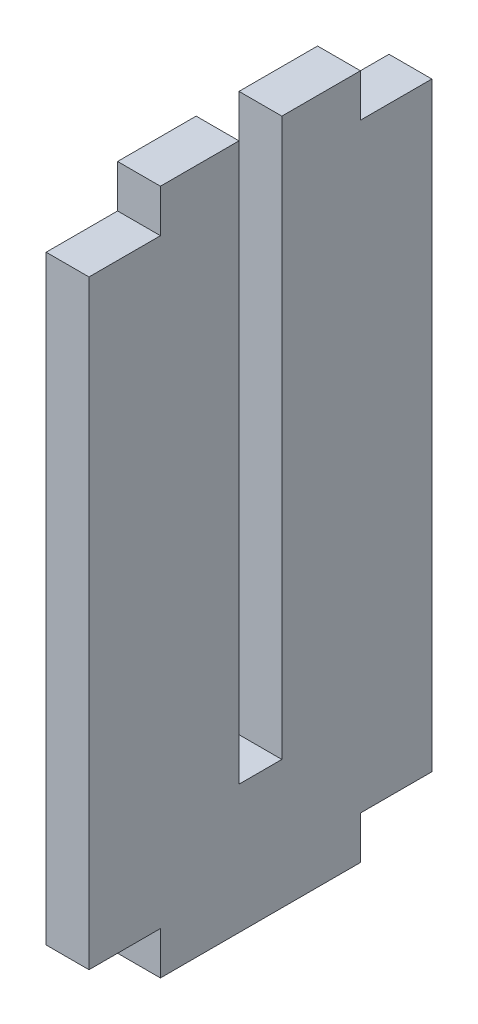
ISO-10303-21;
HEADER;
FILE_DESCRIPTION(('STEP AP214'),'2;1');
FILE_NAME('part.step','',(''),(''),'','','');
FILE_SCHEMA(('AUTOMOTIVE_DESIGN { 1 0 10303 214 1 1 1 1 }'));
ENDSEC;
DATA;
#1=APPLICATION_CONTEXT('core data for automotive mechanical design processes');
#2=APPLICATION_PROTOCOL_DEFINITION('international standard','automotive_design',2000,#1);
#3=PRODUCT_CONTEXT('',#1,'mechanical');
#4=PRODUCT('Part','Part','',(#3));
#5=PRODUCT_RELATED_PRODUCT_CATEGORY('part','',(#4));
#6=PRODUCT_DEFINITION_FORMATION('','',#4);
#7=PRODUCT_DEFINITION_CONTEXT('part definition',#1,'design');
#8=PRODUCT_DEFINITION('design','',#6,#7);
#9=PRODUCT_DEFINITION_SHAPE('','',#8);
#10=(LENGTH_UNIT() NAMED_UNIT(*) SI_UNIT(.MILLI.,.METRE.));
#11=(NAMED_UNIT(*) PLANE_ANGLE_UNIT() SI_UNIT($,.RADIAN.));
#12=(NAMED_UNIT(*) SI_UNIT($,.STERADIAN.) SOLID_ANGLE_UNIT());
#13=UNCERTAINTY_MEASURE_WITH_UNIT(LENGTH_MEASURE(1.E-05),#10,'distance_accuracy_value','');
#14=(GEOMETRIC_REPRESENTATION_CONTEXT(3) GLOBAL_UNCERTAINTY_ASSIGNED_CONTEXT((#13)) GLOBAL_UNIT_ASSIGNED_CONTEXT((#10,
#11,#12)) REPRESENTATION_CONTEXT('',''));
#15=CARTESIAN_POINT('',(0.,0.,0.));
#16=DIRECTION('',(0.,0.,1.));
#17=DIRECTION('',(1.,0.,0.));
#18=AXIS2_PLACEMENT_3D('',#15,#16,#17);
#19=CARTESIAN_POINT('',(6.35,101.6,0.));
#20=DIRECTION('',(0.,-1.,0.));
#21=DIRECTION('',(0.,0.,-1.));
#22=AXIS2_PLACEMENT_3D('',#19,#20,#21);
#23=PLANE('',#22);
#24=DIRECTION('',(0.,0.,1.));
#25=VECTOR('',#24,1.);
#26=CARTESIAN_POINT('',(0.,101.6,0.));
#27=LINE('',#26,#25);
#28=CARTESIAN_POINT('',(0.,101.6,-22.225));
#29=VERTEX_POINT('',#28);
#30=CARTESIAN_POINT('',(0.,101.6,-10.5833333333333));
#31=VERTEX_POINT('',#30);
#32=EDGE_CURVE('E37',#29,#31,#27,.T.);
#33=ORIENTED_EDGE('',*,*,#32,.T.);
#34=DIRECTION('',(1.,0.,0.));
#35=VECTOR('',#34,1.);
#36=CARTESIAN_POINT('',(0.,101.6,-10.5833333333333));
#37=LINE('',#36,#35);
#38=CARTESIAN_POINT('',(6.35,101.6,-10.5833333333333));
#39=VERTEX_POINT('',#38);
#40=EDGE_CURVE('E217',#31,#39,#37,.T.);
#41=ORIENTED_EDGE('',*,*,#40,.T.);
#42=DIRECTION('',(0.,0.,1.));
#43=VECTOR('',#42,1.);
#44=CARTESIAN_POINT('',(6.35,101.6,0.));
#45=LINE('',#44,#43);
#46=CARTESIAN_POINT('',(6.35,101.6,-22.225));
#47=VERTEX_POINT('',#46);
#48=EDGE_CURVE('E42',#47,#39,#45,.T.);
#49=ORIENTED_EDGE('',*,*,#48,.F.);
#50=DIRECTION('',(1.,0.,0.));
#51=VECTOR('',#50,1.);
#52=CARTESIAN_POINT('',(0.,101.6,-22.225));
#53=LINE('',#52,#51);
#54=EDGE_CURVE('E193',#29,#47,#53,.T.);
#55=ORIENTED_EDGE('',*,*,#54,.F.);
#56=EDGE_LOOP('',(#33,#41,#49,#55));
#57=FACE_BOUND('',#56,.T.);
#58=ADVANCED_FACE('F33',(#57),#23,.F.);
#59=CARTESIAN_POINT('',(6.35,0.,0.));
#60=DIRECTION('',(0.,0.,-1.));
#61=DIRECTION('',(-1.,0.,0.));
#62=AXIS2_PLACEMENT_3D('',#59,#60,#61);
#63=PLANE('',#62);
#64=DIRECTION('',(0.,-1.,0.));
#65=VECTOR('',#64,1.);
#66=CARTESIAN_POINT('',(6.35,0.,0.));
#67=LINE('',#66,#65);
#68=CARTESIAN_POINT('',(6.35,95.25,0.));
#69=VERTEX_POINT('',#68);
#70=CARTESIAN_POINT('',(6.35,6.34999999999999,0.));
#71=VERTEX_POINT('',#70);
#72=EDGE_CURVE('E172',#69,#71,#67,.T.);
#73=ORIENTED_EDGE('',*,*,#72,.F.);
#74=DIRECTION('',(1.,0.,0.));
#75=VECTOR('',#74,1.);
#76=CARTESIAN_POINT('',(0.,95.25,0.));
#77=LINE('',#76,#75);
#78=CARTESIAN_POINT('',(0.,95.25,0.));
#79=VERTEX_POINT('',#78);
#80=EDGE_CURVE('E241',#79,#69,#77,.T.);
#81=ORIENTED_EDGE('',*,*,#80,.F.);
#82=DIRECTION('',(0.,-1.,0.));
#83=VECTOR('',#82,1.);
#84=CARTESIAN_POINT('',(0.,0.,0.));
#85=LINE('',#84,#83);
#86=CARTESIAN_POINT('',(0.,6.34999999999999,0.));
#87=VERTEX_POINT('',#86);
#88=EDGE_CURVE('E189',#79,#87,#85,.T.);
#89=ORIENTED_EDGE('',*,*,#88,.T.);
#90=DIRECTION('',(1.,0.,0.));
#91=VECTOR('',#90,1.);
#92=CARTESIAN_POINT('',(0.,6.34999999999999,0.));
#93=LINE('',#92,#91);
#94=EDGE_CURVE('E259',#87,#71,#93,.T.);
#95=ORIENTED_EDGE('',*,*,#94,.T.);
#96=EDGE_LOOP('',(#73,#81,#89,#95));
#97=FACE_BOUND('',#96,.T.);
#98=ADVANCED_FACE('F35',(#97),#63,.F.);
#99=CARTESIAN_POINT('',(6.35,0.,0.));
#100=DIRECTION('',(0.,1.,0.));
#101=DIRECTION('',(0.,0.,1.));
#102=AXIS2_PLACEMENT_3D('',#99,#100,#101);
#103=PLANE('',#102);
#104=DIRECTION('',(0.,0.,-1.));
#105=VECTOR('',#104,1.);
#106=CARTESIAN_POINT('',(0.,0.,0.));
#107=LINE('',#106,#105);
#108=CARTESIAN_POINT('',(0.,0.,-10.5833333333333));
#109=VERTEX_POINT('',#108);
#110=CARTESIAN_POINT('',(0.,0.,-40.2166666666667));
#111=VERTEX_POINT('',#110);
#112=EDGE_CURVE('E183',#109,#111,#107,.T.);
#113=ORIENTED_EDGE('',*,*,#112,.T.);
#114=DIRECTION('',(1.,0.,0.));
#115=VECTOR('',#114,1.);
#116=CARTESIAN_POINT('',(0.,0.,-40.2166666666667));
#117=LINE('',#116,#115);
#118=CARTESIAN_POINT('',(6.35,0.,-40.2166666666667));
#119=VERTEX_POINT('',#118);
#120=EDGE_CURVE('E227',#111,#119,#117,.T.);
#121=ORIENTED_EDGE('',*,*,#120,.T.);
#122=DIRECTION('',(0.,0.,-1.));
#123=VECTOR('',#122,1.);
#124=CARTESIAN_POINT('',(6.35,0.,0.));
#125=LINE('',#124,#123);
#126=CARTESIAN_POINT('',(6.35,0.,-10.5833333333333));
#127=VERTEX_POINT('',#126);
#128=EDGE_CURVE('E174',#127,#119,#125,.T.);
#129=ORIENTED_EDGE('',*,*,#128,.F.);
#130=DIRECTION('',(1.,0.,0.));
#131=VECTOR('',#130,1.);
#132=CARTESIAN_POINT('',(0.,0.,-10.5833333333333));
#133=LINE('',#132,#131);
#134=EDGE_CURVE('E254',#109,#127,#133,.T.);
#135=ORIENTED_EDGE('',*,*,#134,.F.);
#136=EDGE_LOOP('',(#113,#121,#129,#135));
#137=FACE_BOUND('',#136,.T.);
#138=ADVANCED_FACE('F291',(#137),#103,.F.);
#139=CARTESIAN_POINT('',(6.35,0.,-50.8));
#140=DIRECTION('',(0.,0.,1.));
#141=DIRECTION('',(1.,0.,0.));
#142=AXIS2_PLACEMENT_3D('',#139,#140,#141);
#143=PLANE('',#142);
#144=DIRECTION('',(0.,1.,0.));
#145=VECTOR('',#144,1.);
#146=CARTESIAN_POINT('',(6.35,0.,-50.8));
#147=LINE('',#146,#145);
#148=CARTESIAN_POINT('',(6.35,6.34999999999999,-50.8));
#149=VERTEX_POINT('',#148);
#150=CARTESIAN_POINT('',(6.35,95.25,-50.8));
#151=VERTEX_POINT('',#150);
#152=EDGE_CURVE('E196',#149,#151,#147,.T.);
#153=ORIENTED_EDGE('',*,*,#152,.F.);
#154=DIRECTION('',(1.,0.,0.));
#155=VECTOR('',#154,1.);
#156=CARTESIAN_POINT('',(0.,6.34999999999999,-50.8));
#157=LINE('',#156,#155);
#158=CARTESIAN_POINT('',(0.,6.34999999999999,-50.8));
#159=VERTEX_POINT('',#158);
#160=EDGE_CURVE('E223',#159,#149,#157,.T.);
#161=ORIENTED_EDGE('',*,*,#160,.F.);
#162=DIRECTION('',(0.,1.,0.));
#163=VECTOR('',#162,1.);
#164=CARTESIAN_POINT('',(0.,0.,-50.8));
#165=LINE('',#164,#163);
#166=CARTESIAN_POINT('',(0.,95.25,-50.8));
#167=VERTEX_POINT('',#166);
#168=EDGE_CURVE('E177',#159,#167,#165,.T.);
#169=ORIENTED_EDGE('',*,*,#168,.T.);
#170=DIRECTION('',(1.,0.,0.));
#171=VECTOR('',#170,1.);
#172=CARTESIAN_POINT('',(0.,95.25,-50.8));
#173=LINE('',#172,#171);
#174=EDGE_CURVE('E237',#167,#151,#173,.T.);
#175=ORIENTED_EDGE('',*,*,#174,.T.);
#176=EDGE_LOOP('',(#153,#161,#169,#175));
#177=FACE_BOUND('',#176,.T.);
#178=ADVANCED_FACE('F281',(#177),#143,.F.);
#179=CARTESIAN_POINT('',(6.35,101.6,-40.2166666666667));
#180=VERTEX_POINT('',#179);
#181=CARTESIAN_POINT('',(6.35,101.6,-28.575));
#182=VERTEX_POINT('',#181);
#183=EDGE_CURVE('E11',#180,#182,#45,.T.);
#184=ORIENTED_EDGE('',*,*,#183,.F.);
#185=DIRECTION('',(1.,0.,0.));
#186=VECTOR('',#185,1.);
#187=CARTESIAN_POINT('',(0.,101.6,-40.2166666666667));
#188=LINE('',#187,#186);
#189=CARTESIAN_POINT('',(0.,101.6,-40.2166666666667));
#190=VERTEX_POINT('',#189);
#191=EDGE_CURVE('E152',#190,#180,#188,.T.);
#192=ORIENTED_EDGE('',*,*,#191,.F.);
#193=CARTESIAN_POINT('',(0.,101.6,-28.575));
#194=VERTEX_POINT('',#193);
#195=EDGE_CURVE('E166',#190,#194,#27,.T.);
#196=ORIENTED_EDGE('',*,*,#195,.T.);
#197=DIRECTION('',(1.,0.,0.));
#198=VECTOR('',#197,1.);
#199=CARTESIAN_POINT('',(0.,101.6,-28.575));
#200=LINE('',#199,#198);
#201=EDGE_CURVE('E205',#194,#182,#200,.T.);
#202=ORIENTED_EDGE('',*,*,#201,.T.);
#203=EDGE_LOOP('',(#184,#192,#196,#202));
#204=FACE_BOUND('',#203,.T.);
#205=ADVANCED_FACE('F164',(#204),#23,.F.);
#206=CARTESIAN_POINT('',(6.35,0.,0.));
#207=DIRECTION('',(-1.,0.,0.));
#208=DIRECTION('',(0.,0.,1.));
#209=AXIS2_PLACEMENT_3D('',#206,#207,#208);
#210=PLANE('',#209);
#211=ORIENTED_EDGE('',*,*,#48,.T.);
#212=DIRECTION('',(0.,1.,0.));
#213=VECTOR('',#212,1.);
#214=CARTESIAN_POINT('',(6.35,101.6,-10.5833333333333));
#215=LINE('',#214,#213);
#216=CARTESIAN_POINT('',(6.35,95.25,-10.5833333333333));
#217=VERTEX_POINT('',#216);
#218=EDGE_CURVE('E246',#217,#39,#215,.T.);
#219=ORIENTED_EDGE('',*,*,#218,.F.);
#220=DIRECTION('',(0.,0.,-1.));
#221=VECTOR('',#220,1.);
#222=CARTESIAN_POINT('',(6.35,95.25,0.));
#223=LINE('',#222,#221);
#224=EDGE_CURVE('E230',#69,#217,#223,.T.);
#225=ORIENTED_EDGE('',*,*,#224,.F.);
#226=ORIENTED_EDGE('',*,*,#72,.T.);
#227=DIRECTION('',(0.,0.,1.));
#228=VECTOR('',#227,1.);
#229=CARTESIAN_POINT('',(6.35,6.34999999999999,0.));
#230=LINE('',#229,#228);
#231=CARTESIAN_POINT('',(6.35,6.34999999999999,-10.5833333333333));
#232=VERTEX_POINT('',#231);
#233=EDGE_CURVE('E263',#232,#71,#230,.T.);
#234=ORIENTED_EDGE('',*,*,#233,.F.);
#235=DIRECTION('',(0.,1.,0.));
#236=VECTOR('',#235,1.);
#237=CARTESIAN_POINT('',(6.35,0.,-10.5833333333333));
#238=LINE('',#237,#236);
#239=EDGE_CURVE('E266',#127,#232,#238,.T.);
#240=ORIENTED_EDGE('',*,*,#239,.F.);
#241=ORIENTED_EDGE('',*,*,#128,.T.);
#242=DIRECTION('',(0.,-1.,0.));
#243=VECTOR('',#242,1.);
#244=CARTESIAN_POINT('',(6.35,0.,-40.2166666666667));
#245=LINE('',#244,#243);
#246=CARTESIAN_POINT('',(6.35,6.34999999999999,-40.2166666666667));
#247=VERTEX_POINT('',#246);
#248=EDGE_CURVE('E231',#247,#119,#245,.T.);
#249=ORIENTED_EDGE('',*,*,#248,.F.);
#250=DIRECTION('',(0.,0.,1.));
#251=VECTOR('',#250,1.);
#252=CARTESIAN_POINT('',(6.35,6.34999999999999,-50.8));
#253=LINE('',#252,#251);
#254=EDGE_CURVE('E234',#149,#247,#253,.T.);
#255=ORIENTED_EDGE('',*,*,#254,.F.);
#256=ORIENTED_EDGE('',*,*,#152,.T.);
#257=DIRECTION('',(0.,0.,-1.));
#258=VECTOR('',#257,1.);
#259=CARTESIAN_POINT('',(6.35,95.25,-50.8));
#260=LINE('',#259,#258);
#261=CARTESIAN_POINT('',(6.35,95.25,-40.2166666666667));
#262=VERTEX_POINT('',#261);
#263=EDGE_CURVE('E159',#262,#151,#260,.T.);
#264=ORIENTED_EDGE('',*,*,#263,.F.);
#265=DIRECTION('',(0.,-1.,0.));
#266=VECTOR('',#265,1.);
#267=CARTESIAN_POINT('',(6.35,101.6,-40.2166666666667));
#268=LINE('',#267,#266);
#269=EDGE_CURVE('E262',#180,#262,#268,.T.);
#270=ORIENTED_EDGE('',*,*,#269,.F.);
#271=ORIENTED_EDGE('',*,*,#183,.T.);
#272=DIRECTION('',(0.,1.,0.));
#273=VECTOR('',#272,1.);
#274=CARTESIAN_POINT('',(6.35,101.6,-28.575));
#275=LINE('',#274,#273);
#276=CARTESIAN_POINT('',(6.35,19.05,-28.575));
#277=VERTEX_POINT('',#276);
#278=EDGE_CURVE('E208',#277,#182,#275,.T.);
#279=ORIENTED_EDGE('',*,*,#278,.F.);
#280=DIRECTION('',(0.,0.,-1.));
#281=VECTOR('',#280,1.);
#282=CARTESIAN_POINT('',(6.35,19.05,-22.225));
#283=LINE('',#282,#281);
#284=CARTESIAN_POINT('',(6.35,19.05,-22.225));
#285=VERTEX_POINT('',#284);
#286=EDGE_CURVE('E211',#285,#277,#283,.T.);
#287=ORIENTED_EDGE('',*,*,#286,.F.);
#288=DIRECTION('',(0.,-1.,0.));
#289=VECTOR('',#288,1.);
#290=CARTESIAN_POINT('',(6.35,101.6,-22.225));
#291=LINE('',#290,#289);
#292=EDGE_CURVE('E214',#47,#285,#291,.T.);
#293=ORIENTED_EDGE('',*,*,#292,.F.);
#294=EDGE_LOOP('',(#211,#219,#225,#226,#234,#240,#241,#249,#255,#256,#264,#270,#271,#279,#287,#293));
#295=FACE_BOUND('',#294,.T.);
#296=ADVANCED_FACE('F284',(#295),#210,.F.);
#297=CARTESIAN_POINT('',(0.,0.,0.));
#298=DIRECTION('',(-1.,0.,0.));
#299=DIRECTION('',(0.,0.,1.));
#300=AXIS2_PLACEMENT_3D('',#297,#298,#299);
#301=PLANE('',#300);
#302=DIRECTION('',(0.,1.,0.));
#303=VECTOR('',#302,1.);
#304=CARTESIAN_POINT('',(0.,101.6,-10.5833333333333));
#305=LINE('',#304,#303);
#306=CARTESIAN_POINT('',(0.,95.25,-10.5833333333333));
#307=VERTEX_POINT('',#306);
#308=EDGE_CURVE('E50',#307,#31,#305,.T.);
#309=ORIENTED_EDGE('',*,*,#308,.T.);
#310=ORIENTED_EDGE('',*,*,#32,.F.);
#311=DIRECTION('',(0.,-1.,0.));
#312=VECTOR('',#311,1.);
#313=CARTESIAN_POINT('',(0.,101.6,-22.225));
#314=LINE('',#313,#312);
#315=CARTESIAN_POINT('',(0.,19.05,-22.225));
#316=VERTEX_POINT('',#315);
#317=EDGE_CURVE('E210',#29,#316,#314,.T.);
#318=ORIENTED_EDGE('',*,*,#317,.T.);
#319=DIRECTION('',(0.,0.,-1.));
#320=VECTOR('',#319,1.);
#321=CARTESIAN_POINT('',(0.,19.05,-22.225));
#322=LINE('',#321,#320);
#323=CARTESIAN_POINT('',(0.,19.05,-28.575));
#324=VERTEX_POINT('',#323);
#325=EDGE_CURVE('E219',#316,#324,#322,.T.);
#326=ORIENTED_EDGE('',*,*,#325,.T.);
#327=DIRECTION('',(0.,1.,0.));
#328=VECTOR('',#327,1.);
#329=CARTESIAN_POINT('',(0.,101.6,-28.575));
#330=LINE('',#329,#328);
#331=EDGE_CURVE('E171',#324,#194,#330,.T.);
#332=ORIENTED_EDGE('',*,*,#331,.T.);
#333=ORIENTED_EDGE('',*,*,#195,.F.);
#334=DIRECTION('',(0.,-1.,0.));
#335=VECTOR('',#334,1.);
#336=CARTESIAN_POINT('',(0.,101.6,-40.2166666666667));
#337=LINE('',#336,#335);
#338=CARTESIAN_POINT('',(0.,95.25,-40.2166666666667));
#339=VERTEX_POINT('',#338);
#340=EDGE_CURVE('E148',#190,#339,#337,.T.);
#341=ORIENTED_EDGE('',*,*,#340,.T.);
#342=DIRECTION('',(0.,0.,-1.));
#343=VECTOR('',#342,1.);
#344=CARTESIAN_POINT('',(0.,95.25,-50.8));
#345=LINE('',#344,#343);
#346=EDGE_CURVE('E158',#339,#167,#345,.T.);
#347=ORIENTED_EDGE('',*,*,#346,.T.);
#348=ORIENTED_EDGE('',*,*,#168,.F.);
#349=DIRECTION('',(0.,0.,1.));
#350=VECTOR('',#349,1.);
#351=CARTESIAN_POINT('',(0.,6.34999999999999,-50.8));
#352=LINE('',#351,#350);
#353=CARTESIAN_POINT('',(0.,6.34999999999999,-40.2166666666667));
#354=VERTEX_POINT('',#353);
#355=EDGE_CURVE('E233',#159,#354,#352,.T.);
#356=ORIENTED_EDGE('',*,*,#355,.T.);
#357=DIRECTION('',(0.,-1.,0.));
#358=VECTOR('',#357,1.);
#359=CARTESIAN_POINT('',(0.,0.,-40.2166666666667));
#360=LINE('',#359,#358);
#361=EDGE_CURVE('E58',#354,#111,#360,.T.);
#362=ORIENTED_EDGE('',*,*,#361,.T.);
#363=ORIENTED_EDGE('',*,*,#112,.F.);
#364=DIRECTION('',(0.,1.,0.));
#365=VECTOR('',#364,1.);
#366=CARTESIAN_POINT('',(0.,0.,-10.5833333333333));
#367=LINE('',#366,#365);
#368=CARTESIAN_POINT('',(0.,6.34999999999999,-10.5833333333333));
#369=VERTEX_POINT('',#368);
#370=EDGE_CURVE('E265',#109,#369,#367,.T.);
#371=ORIENTED_EDGE('',*,*,#370,.T.);
#372=DIRECTION('',(0.,0.,1.));
#373=VECTOR('',#372,1.);
#374=CARTESIAN_POINT('',(0.,6.34999999999999,0.));
#375=LINE('',#374,#373);
#376=EDGE_CURVE('E257',#369,#87,#375,.T.);
#377=ORIENTED_EDGE('',*,*,#376,.T.);
#378=ORIENTED_EDGE('',*,*,#88,.F.);
#379=DIRECTION('',(0.,0.,-1.));
#380=VECTOR('',#379,1.);
#381=CARTESIAN_POINT('',(0.,95.25,0.));
#382=LINE('',#381,#380);
#383=EDGE_CURVE('E248',#79,#307,#382,.T.);
#384=ORIENTED_EDGE('',*,*,#383,.T.);
#385=EDGE_LOOP('',(#309,#310,#318,#326,#332,#333,#341,#347,#348,#356,#362,#363,#371,#377,#378,#384));
#386=FACE_BOUND('',#385,.T.);
#387=ADVANCED_FACE('F169',(#386),#301,.T.);
#388=CARTESIAN_POINT('',(0.,101.6,-22.225));
#389=DIRECTION('',(0.,0.,1.));
#390=DIRECTION('',(0.,-1.,0.));
#391=AXIS2_PLACEMENT_3D('',#388,#389,#390);
#392=PLANE('',#391);
#393=ORIENTED_EDGE('',*,*,#292,.T.);
#394=DIRECTION('',(1.,0.,0.));
#395=VECTOR('',#394,1.);
#396=CARTESIAN_POINT('',(0.,19.05,-22.225));
#397=LINE('',#396,#395);
#398=EDGE_CURVE('E201',#316,#285,#397,.T.);
#399=ORIENTED_EDGE('',*,*,#398,.F.);
#400=ORIENTED_EDGE('',*,*,#317,.F.);
#401=ORIENTED_EDGE('',*,*,#54,.T.);
#402=EDGE_LOOP('',(#393,#399,#400,#401));
#403=FACE_BOUND('',#402,.T.);
#404=ADVANCED_FACE('F314',(#403),#392,.F.);
#405=CARTESIAN_POINT('',(0.,101.6,-28.575));
#406=DIRECTION('',(0.,0.,-1.));
#407=DIRECTION('',(-1.,0.,0.));
#408=AXIS2_PLACEMENT_3D('',#405,#406,#407);
#409=PLANE('',#408);
#410=ORIENTED_EDGE('',*,*,#278,.T.);
#411=ORIENTED_EDGE('',*,*,#201,.F.);
#412=ORIENTED_EDGE('',*,*,#331,.F.);
#413=DIRECTION('',(1.,0.,0.));
#414=VECTOR('',#413,1.);
#415=CARTESIAN_POINT('',(0.,19.05,-28.575));
#416=LINE('',#415,#414);
#417=EDGE_CURVE('E203',#324,#277,#416,.T.);
#418=ORIENTED_EDGE('',*,*,#417,.T.);
#419=EDGE_LOOP('',(#410,#411,#412,#418));
#420=FACE_BOUND('',#419,.T.);
#421=ADVANCED_FACE('F320',(#420),#409,.F.);
#422=CARTESIAN_POINT('',(0.,19.05,-22.225));
#423=DIRECTION('',(0.,-1.,0.));
#424=DIRECTION('',(0.,0.,-1.));
#425=AXIS2_PLACEMENT_3D('',#422,#423,#424);
#426=PLANE('',#425);
#427=ORIENTED_EDGE('',*,*,#286,.T.);
#428=ORIENTED_EDGE('',*,*,#417,.F.);
#429=ORIENTED_EDGE('',*,*,#325,.F.);
#430=ORIENTED_EDGE('',*,*,#398,.T.);
#431=EDGE_LOOP('',(#427,#428,#429,#430));
#432=FACE_BOUND('',#431,.T.);
#433=ADVANCED_FACE('F318',(#432),#426,.F.);
#434=CARTESIAN_POINT('',(0.,6.34999999999999,0.));
#435=DIRECTION('',(0.,1.,0.));
#436=DIRECTION('',(0.,0.,1.));
#437=AXIS2_PLACEMENT_3D('',#434,#435,#436);
#438=PLANE('',#437);
#439=ORIENTED_EDGE('',*,*,#233,.T.);
#440=ORIENTED_EDGE('',*,*,#94,.F.);
#441=ORIENTED_EDGE('',*,*,#376,.F.);
#442=DIRECTION('',(1.,0.,0.));
#443=VECTOR('',#442,1.);
#444=CARTESIAN_POINT('',(0.,6.34999999999999,-10.5833333333333));
#445=LINE('',#444,#443);
#446=EDGE_CURVE('E256',#369,#232,#445,.T.);
#447=ORIENTED_EDGE('',*,*,#446,.T.);
#448=EDGE_LOOP('',(#439,#440,#441,#447));
#449=FACE_BOUND('',#448,.T.);
#450=ADVANCED_FACE('F301',(#449),#438,.F.);
#451=CARTESIAN_POINT('',(0.,0.,-10.5833333333333));
#452=DIRECTION('',(0.,0.,-1.));
#453=DIRECTION('',(-1.,0.,0.));
#454=AXIS2_PLACEMENT_3D('',#451,#452,#453);
#455=PLANE('',#454);
#456=ORIENTED_EDGE('',*,*,#239,.T.);
#457=ORIENTED_EDGE('',*,*,#446,.F.);
#458=ORIENTED_EDGE('',*,*,#370,.F.);
#459=ORIENTED_EDGE('',*,*,#134,.T.);
#460=EDGE_LOOP('',(#456,#457,#458,#459));
#461=FACE_BOUND('',#460,.T.);
#462=ADVANCED_FACE('F295',(#461),#455,.F.);
#463=CARTESIAN_POINT('',(0.,95.25,-50.8));
#464=DIRECTION('',(0.,-1.,0.));
#465=DIRECTION('',(0.,0.,-1.));
#466=AXIS2_PLACEMENT_3D('',#463,#464,#465);
#467=PLANE('',#466);
#468=ORIENTED_EDGE('',*,*,#263,.T.);
#469=ORIENTED_EDGE('',*,*,#174,.F.);
#470=ORIENTED_EDGE('',*,*,#346,.F.);
#471=DIRECTION('',(1.,0.,0.));
#472=VECTOR('',#471,1.);
#473=CARTESIAN_POINT('',(0.,95.25,-40.2166666666667));
#474=LINE('',#473,#472);
#475=EDGE_CURVE('E154',#339,#262,#474,.T.);
#476=ORIENTED_EDGE('',*,*,#475,.T.);
#477=EDGE_LOOP('',(#468,#469,#470,#476));
#478=FACE_BOUND('',#477,.T.);
#479=ADVANCED_FACE('F278',(#478),#467,.F.);
#480=CARTESIAN_POINT('',(0.,101.6,-40.2166666666667));
#481=DIRECTION('',(0.,0.,1.));
#482=DIRECTION('',(1.,0.,0.));
#483=AXIS2_PLACEMENT_3D('',#480,#481,#482);
#484=PLANE('',#483);
#485=ORIENTED_EDGE('',*,*,#269,.T.);
#486=ORIENTED_EDGE('',*,*,#475,.F.);
#487=ORIENTED_EDGE('',*,*,#340,.F.);
#488=ORIENTED_EDGE('',*,*,#191,.T.);
#489=EDGE_LOOP('',(#485,#486,#487,#488));
#490=FACE_BOUND('',#489,.T.);
#491=ADVANCED_FACE('F151',(#490),#484,.F.);
#492=CARTESIAN_POINT('',(0.,0.,-40.2166666666667));
#493=DIRECTION('',(0.,0.,1.));
#494=DIRECTION('',(1.,0.,0.));
#495=AXIS2_PLACEMENT_3D('',#492,#493,#494);
#496=PLANE('',#495);
#497=ORIENTED_EDGE('',*,*,#248,.T.);
#498=ORIENTED_EDGE('',*,*,#120,.F.);
#499=ORIENTED_EDGE('',*,*,#361,.F.);
#500=DIRECTION('',(1.,0.,0.));
#501=VECTOR('',#500,1.);
#502=CARTESIAN_POINT('',(0.,6.34999999999999,-40.2166666666667));
#503=LINE('',#502,#501);
#504=EDGE_CURVE('E225',#354,#247,#503,.T.);
#505=ORIENTED_EDGE('',*,*,#504,.T.);
#506=EDGE_LOOP('',(#497,#498,#499,#505));
#507=FACE_BOUND('',#506,.T.);
#508=ADVANCED_FACE('F406',(#507),#496,.F.);
#509=CARTESIAN_POINT('',(0.,6.34999999999999,-50.8));
#510=DIRECTION('',(0.,1.,0.));
#511=DIRECTION('',(0.,0.,1.));
#512=AXIS2_PLACEMENT_3D('',#509,#510,#511);
#513=PLANE('',#512);
#514=ORIENTED_EDGE('',*,*,#254,.T.);
#515=ORIENTED_EDGE('',*,*,#504,.F.);
#516=ORIENTED_EDGE('',*,*,#355,.F.);
#517=ORIENTED_EDGE('',*,*,#160,.T.);
#518=EDGE_LOOP('',(#514,#515,#516,#517));
#519=FACE_BOUND('',#518,.T.);
#520=ADVANCED_FACE('F287',(#519),#513,.F.);
#521=CARTESIAN_POINT('',(0.,101.6,-10.5833333333333));
#522=DIRECTION('',(0.,0.,-1.));
#523=DIRECTION('',(-1.,0.,0.));
#524=AXIS2_PLACEMENT_3D('',#521,#522,#523);
#525=PLANE('',#524);
#526=ORIENTED_EDGE('',*,*,#218,.T.);
#527=ORIENTED_EDGE('',*,*,#40,.F.);
#528=ORIENTED_EDGE('',*,*,#308,.F.);
#529=DIRECTION('',(1.,0.,0.));
#530=VECTOR('',#529,1.);
#531=CARTESIAN_POINT('',(0.,95.25,-10.5833333333333));
#532=LINE('',#531,#530);
#533=EDGE_CURVE('E243',#307,#217,#532,.T.);
#534=ORIENTED_EDGE('',*,*,#533,.T.);
#535=EDGE_LOOP('',(#526,#527,#528,#534));
#536=FACE_BOUND('',#535,.T.);
#537=ADVANCED_FACE('F308',(#536),#525,.F.);
#538=CARTESIAN_POINT('',(0.,95.25,0.));
#539=DIRECTION('',(0.,-1.,0.));
#540=DIRECTION('',(0.,0.,-1.));
#541=AXIS2_PLACEMENT_3D('',#538,#539,#540);
#542=PLANE('',#541);
#543=ORIENTED_EDGE('',*,*,#224,.T.);
#544=ORIENTED_EDGE('',*,*,#533,.F.);
#545=ORIENTED_EDGE('',*,*,#383,.F.);
#546=ORIENTED_EDGE('',*,*,#80,.T.);
#547=EDGE_LOOP('',(#543,#544,#545,#546));
#548=FACE_BOUND('',#547,.T.);
#549=ADVANCED_FACE('F306',(#548),#542,.F.);
#550=CLOSED_SHELL('',(#58,#98,#138,#178,#205,#296,#387,#404,#421,#433,#450,#462,#479,#491,#508,
#520,#537,#549));
#551=MANIFOLD_SOLID_BREP('B2',#550);
#552=ADVANCED_BREP_SHAPE_REPRESENTATION('',(#18,#551),#14);
#553=SHAPE_DEFINITION_REPRESENTATION(#9,#552);
ENDSEC;
END-ISO-10303-21;
